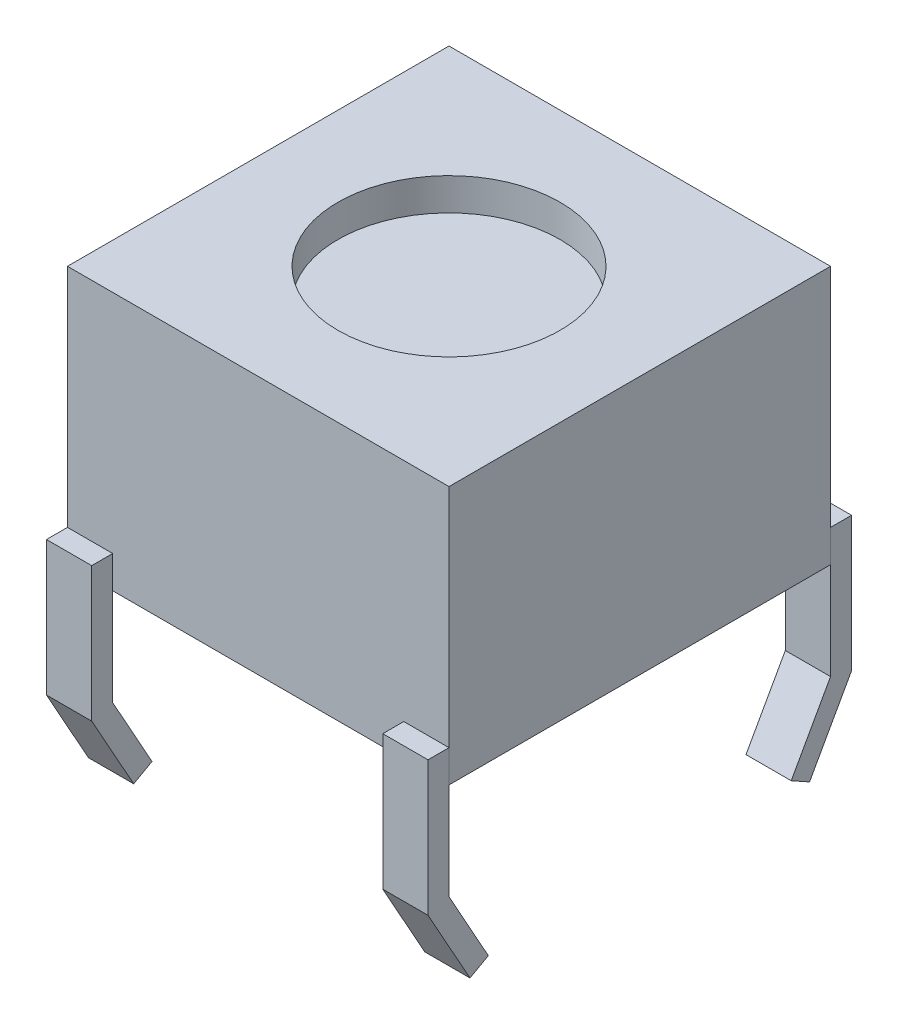
ISO-10303-21;
HEADER;
FILE_DESCRIPTION(('STEP AP214'),'2;1');
FILE_NAME('part.step','',(''),(''),'','','');
FILE_SCHEMA(('AUTOMOTIVE_DESIGN { 1 0 10303 214 1 1 1 1 }'));
ENDSEC;
DATA;
#1=APPLICATION_CONTEXT('core data for automotive mechanical design processes');
#2=APPLICATION_PROTOCOL_DEFINITION('international standard','automotive_design',2000,#1);
#3=PRODUCT_CONTEXT('',#1,'mechanical');
#4=PRODUCT('Part','Part','',(#3));
#5=PRODUCT_RELATED_PRODUCT_CATEGORY('part','',(#4));
#6=PRODUCT_DEFINITION_FORMATION('','',#4);
#7=PRODUCT_DEFINITION_CONTEXT('part definition',#1,'design');
#8=PRODUCT_DEFINITION('design','',#6,#7);
#9=PRODUCT_DEFINITION_SHAPE('','',#8);
#10=(LENGTH_UNIT() NAMED_UNIT(*) SI_UNIT(.MILLI.,.METRE.));
#11=(NAMED_UNIT(*) PLANE_ANGLE_UNIT() SI_UNIT($,.RADIAN.));
#12=(NAMED_UNIT(*) SI_UNIT($,.STERADIAN.) SOLID_ANGLE_UNIT());
#13=UNCERTAINTY_MEASURE_WITH_UNIT(LENGTH_MEASURE(1.E-05),#10,'distance_accuracy_value','');
#14=(GEOMETRIC_REPRESENTATION_CONTEXT(3) GLOBAL_UNCERTAINTY_ASSIGNED_CONTEXT((#13)) GLOBAL_UNIT_ASSIGNED_CONTEXT((#10,
#11,#12)) REPRESENTATION_CONTEXT('',''));
#15=CARTESIAN_POINT('',(0.,0.,0.));
#16=DIRECTION('',(0.,0.,1.));
#17=DIRECTION('',(1.,0.,0.));
#18=AXIS2_PLACEMENT_3D('',#15,#16,#17);
#19=CARTESIAN_POINT('',(3.,4.064,-3.));
#20=DIRECTION('',(-1.,0.,0.));
#21=DIRECTION('',(0.,0.,1.));
#22=AXIS2_PLACEMENT_3D('',#19,#20,#21);
#23=PLANE('',#22);
#24=DIRECTION('',(0.,-1.,0.));
#25=VECTOR('',#24,1.);
#26=CARTESIAN_POINT('',(3.,4.064,-3.00000000000001));
#27=LINE('',#26,#25);
#28=CARTESIAN_POINT('',(3.,0.508,-3.));
#29=VERTEX_POINT('',#28);
#30=CARTESIAN_POINT('',(3.,0.,-3.));
#31=VERTEX_POINT('',#30);
#32=EDGE_CURVE('E11',#29,#31,#27,.T.);
#33=ORIENTED_EDGE('',*,*,#32,.F.);
#34=DIRECTION('',(0.,-1.,0.));
#35=VECTOR('',#34,1.);
#36=CARTESIAN_POINT('',(3.,4.064,-3.));
#37=LINE('',#36,#35);
#38=CARTESIAN_POINT('',(3.,4.064,-3.));
#39=VERTEX_POINT('',#38);
#40=EDGE_CURVE('E446',#39,#29,#37,.T.);
#41=ORIENTED_EDGE('',*,*,#40,.F.);
#42=DIRECTION('',(0.,0.,-1.));
#43=VECTOR('',#42,1.);
#44=CARTESIAN_POINT('',(3.,4.064,-3.));
#45=LINE('',#44,#43);
#46=CARTESIAN_POINT('',(3.,4.064,3.));
#47=VERTEX_POINT('',#46);
#48=EDGE_CURVE('E414',#47,#39,#45,.T.);
#49=ORIENTED_EDGE('',*,*,#48,.F.);
#50=DIRECTION('',(0.,-1.,0.));
#51=VECTOR('',#50,1.);
#52=CARTESIAN_POINT('',(3.,4.064,3.));
#53=LINE('',#52,#51);
#54=CARTESIAN_POINT('',(3.,0.508,3.));
#55=VERTEX_POINT('',#54);
#56=EDGE_CURVE('E424',#47,#55,#53,.T.);
#57=ORIENTED_EDGE('',*,*,#56,.T.);
#58=DIRECTION('',(0.,1.,0.));
#59=VECTOR('',#58,1.);
#60=CARTESIAN_POINT('',(3.,4.064,3.));
#61=LINE('',#60,#59);
#62=CARTESIAN_POINT('',(3.,0.,3.));
#63=VERTEX_POINT('',#62);
#64=EDGE_CURVE('E450',#63,#55,#61,.T.);
#65=ORIENTED_EDGE('',*,*,#64,.F.);
#66=DIRECTION('',(0.,0.,-1.));
#67=VECTOR('',#66,1.);
#68=CARTESIAN_POINT('',(3.,0.,-3.));
#69=LINE('',#68,#67);
#70=EDGE_CURVE('E403',#63,#31,#69,.T.);
#71=ORIENTED_EDGE('',*,*,#70,.T.);
#72=EDGE_LOOP('',(#33,#41,#49,#57,#65,#71));
#73=FACE_BOUND('',#72,.T.);
#74=ADVANCED_FACE('F39',(#73),#23,.F.);
#75=CARTESIAN_POINT('',(-3.,4.064,-3.));
#76=DIRECTION('',(1.,0.,0.));
#77=DIRECTION('',(0.,0.,-1.));
#78=AXIS2_PLACEMENT_3D('',#75,#76,#77);
#79=PLANE('',#78);
#80=DIRECTION('',(0.,1.,0.));
#81=VECTOR('',#80,1.);
#82=CARTESIAN_POINT('',(-3.,4.064,-3.00000000000001));
#83=LINE('',#82,#81);
#84=CARTESIAN_POINT('',(-2.999999938,0.,-3.));
#85=VERTEX_POINT('',#84);
#86=CARTESIAN_POINT('',(-3.,0.508,-3.));
#87=VERTEX_POINT('',#86);
#88=EDGE_CURVE('E43',#85,#87,#83,.T.);
#89=ORIENTED_EDGE('',*,*,#88,.F.);
#90=DIRECTION('',(0.,0.,1.));
#91=VECTOR('',#90,1.);
#92=CARTESIAN_POINT('',(-3.,0.,-3.));
#93=LINE('',#92,#91);
#94=CARTESIAN_POINT('',(-3.,0.,3.));
#95=VERTEX_POINT('',#94);
#96=EDGE_CURVE('E430',#85,#95,#93,.T.);
#97=ORIENTED_EDGE('',*,*,#96,.T.);
#98=DIRECTION('',(0.,-1.,0.));
#99=VECTOR('',#98,1.);
#100=CARTESIAN_POINT('',(-3.,4.064,3.));
#101=LINE('',#100,#99);
#102=CARTESIAN_POINT('',(-3.,0.508,3.));
#103=VERTEX_POINT('',#102);
#104=EDGE_CURVE('E449',#103,#95,#101,.T.);
#105=ORIENTED_EDGE('',*,*,#104,.F.);
#106=DIRECTION('',(0.,-1.,0.));
#107=VECTOR('',#106,1.);
#108=CARTESIAN_POINT('',(-3.,4.064,3.));
#109=LINE('',#108,#107);
#110=CARTESIAN_POINT('',(-3.,4.064,3.));
#111=VERTEX_POINT('',#110);
#112=EDGE_CURVE('E440',#111,#103,#109,.T.);
#113=ORIENTED_EDGE('',*,*,#112,.F.);
#114=DIRECTION('',(0.,0.,1.));
#115=VECTOR('',#114,1.);
#116=CARTESIAN_POINT('',(-3.,4.064,-3.));
#117=LINE('',#116,#115);
#118=CARTESIAN_POINT('',(-3.,4.064,-3.));
#119=VERTEX_POINT('',#118);
#120=EDGE_CURVE('E420',#119,#111,#117,.T.);
#121=ORIENTED_EDGE('',*,*,#120,.F.);
#122=DIRECTION('',(0.,-1.,0.));
#123=VECTOR('',#122,1.);
#124=CARTESIAN_POINT('',(-3.,4.064,-3.));
#125=LINE('',#124,#123);
#126=EDGE_CURVE('E443',#119,#87,#125,.T.);
#127=ORIENTED_EDGE('',*,*,#126,.T.);
#128=EDGE_LOOP('',(#89,#97,#105,#113,#121,#127));
#129=FACE_BOUND('',#128,.T.);
#130=ADVANCED_FACE('F467',(#129),#79,.F.);
#131=DIRECTION('',(0.,0.,-1.));
#132=VECTOR('',#131,1.);
#133=CARTESIAN_POINT('',(3.,0.508,-3.3302));
#134=LINE('',#133,#132);
#135=CARTESIAN_POINT('',(3.,0.508,-3.3302));
#136=VERTEX_POINT('',#135);
#137=EDGE_CURVE('E295',#29,#136,#134,.T.);
#138=ORIENTED_EDGE('',*,*,#137,.F.);
#139=ORIENTED_EDGE('',*,*,#32,.T.);
#140=DIRECTION('',(0.,1.,0.));
#141=VECTOR('',#140,1.);
#142=CARTESIAN_POINT('',(3.,0.,-3.));
#143=LINE('',#142,#141);
#144=CARTESIAN_POINT('',(3.,-1.524,-3.));
#145=VERTEX_POINT('',#144);
#146=EDGE_CURVE('E283',#145,#31,#143,.T.);
#147=ORIENTED_EDGE('',*,*,#146,.F.);
#148=DIRECTION('',(0.,0.87336080929187,-0.487073810415886));
#149=VECTOR('',#148,1.);
#150=CARTESIAN_POINT('',(3.,-1.524,-3.));
#151=LINE('',#150,#149);
#152=CARTESIAN_POINT('',(3.,-2.63316822780067,-2.38141626077182));
#153=VERTEX_POINT('',#152);
#154=EDGE_CURVE('E286',#153,#145,#151,.T.);
#155=ORIENTED_EDGE('',*,*,#154,.F.);
#156=DIRECTION('',(0.,0.487073810415882,0.873360809291872));
#157=VECTOR('',#156,1.);
#158=CARTESIAN_POINT('',(3.,-2.63316822780067,-2.38141626077182));
#159=LINE('',#158,#157);
#160=CARTESIAN_POINT('',(3.,-2.794,-2.6698));
#161=VERTEX_POINT('',#160);
#162=EDGE_CURVE('E289',#161,#153,#159,.T.);
#163=ORIENTED_EDGE('',*,*,#162,.F.);
#164=DIRECTION('',(0.,-0.873360809291872,0.487073810415883));
#165=VECTOR('',#164,1.);
#166=CARTESIAN_POINT('',(3.,-2.794,-2.6698));
#167=LINE('',#166,#165);
#168=CARTESIAN_POINT('',(3.,-1.609852,-3.3302));
#169=VERTEX_POINT('',#168);
#170=EDGE_CURVE('E291',#169,#161,#167,.T.);
#171=ORIENTED_EDGE('',*,*,#170,.F.);
#172=DIRECTION('',(0.,-1.,0.));
#173=VECTOR('',#172,1.);
#174=CARTESIAN_POINT('',(3.,-1.609852,-3.3302));
#175=LINE('',#174,#173);
#176=EDGE_CURVE('E293',#136,#169,#175,.T.);
#177=ORIENTED_EDGE('',*,*,#176,.F.);
#178=EDGE_LOOP('',(#138,#139,#147,#155,#163,#171,#177));
#179=FACE_BOUND('',#178,.T.);
#180=ADVANCED_FACE('F514',(#179),#23,.F.);
#181=DIRECTION('',(0.,1.,0.));
#182=VECTOR('',#181,1.);
#183=CARTESIAN_POINT('',(-2.999999938,0.,-3.));
#184=LINE('',#183,#182);
#185=CARTESIAN_POINT('',(-2.999999938,-1.524,-3.));
#186=VERTEX_POINT('',#185);
#187=EDGE_CURVE('E236',#186,#85,#184,.T.);
#188=ORIENTED_EDGE('',*,*,#187,.T.);
#189=ORIENTED_EDGE('',*,*,#88,.T.);
#190=DIRECTION('',(0.,0.,-1.));
#191=VECTOR('',#190,1.);
#192=CARTESIAN_POINT('',(-2.999999938,0.508,-3.3302));
#193=LINE('',#192,#191);
#194=CARTESIAN_POINT('',(-2.999999938,0.508,-3.3302));
#195=VERTEX_POINT('',#194);
#196=EDGE_CURVE('E259',#87,#195,#193,.T.);
#197=ORIENTED_EDGE('',*,*,#196,.T.);
#198=DIRECTION('',(0.,-1.,0.));
#199=VECTOR('',#198,1.);
#200=CARTESIAN_POINT('',(-2.999999938,-1.609852,-3.3302));
#201=LINE('',#200,#199);
#202=CARTESIAN_POINT('',(-2.999999938,-1.609852,-3.3302));
#203=VERTEX_POINT('',#202);
#204=EDGE_CURVE('E263',#195,#203,#201,.T.);
#205=ORIENTED_EDGE('',*,*,#204,.T.);
#206=DIRECTION('',(0.,-0.873360809291872,0.487073810415883));
#207=VECTOR('',#206,1.);
#208=CARTESIAN_POINT('',(-2.999999938,-2.794,-2.6698));
#209=LINE('',#208,#207);
#210=CARTESIAN_POINT('',(-2.999999938,-2.794,-2.6698));
#211=VERTEX_POINT('',#210);
#212=EDGE_CURVE('E923',#203,#211,#209,.T.);
#213=ORIENTED_EDGE('',*,*,#212,.T.);
#214=DIRECTION('',(0.,0.487073810415882,0.873360809291872));
#215=VECTOR('',#214,1.);
#216=CARTESIAN_POINT('',(-2.999999938,-2.63316822780067,-2.38141626077182));
#217=LINE('',#216,#215);
#218=CARTESIAN_POINT('',(-2.999999938,-2.63316822780067,-2.38141626077182));
#219=VERTEX_POINT('',#218);
#220=EDGE_CURVE('E250',#211,#219,#217,.T.);
#221=ORIENTED_EDGE('',*,*,#220,.T.);
#222=DIRECTION('',(0.,0.87336080929187,-0.487073810415886));
#223=VECTOR('',#222,1.);
#224=CARTESIAN_POINT('',(-2.999999938,-1.524,-3.));
#225=LINE('',#224,#223);
#226=EDGE_CURVE('E244',#219,#186,#225,.T.);
#227=ORIENTED_EDGE('',*,*,#226,.T.);
#228=EDGE_LOOP('',(#188,#189,#197,#205,#213,#221,#227));
#229=FACE_BOUND('',#228,.T.);
#230=ADVANCED_FACE('F248',(#229),#79,.F.);
#231=CARTESIAN_POINT('',(-3.,4.064,-3.));
#232=DIRECTION('',(0.,0.,1.));
#233=DIRECTION('',(1.,0.,0.));
#234=AXIS2_PLACEMENT_3D('',#231,#232,#233);
#235=PLANE('',#234);
#236=DIRECTION('',(1.,0.,0.));
#237=VECTOR('',#236,1.);
#238=CARTESIAN_POINT('',(-2.999999938,0.508,-3.));
#239=LINE('',#238,#237);
#240=CARTESIAN_POINT('',(-2.288799938,0.508,-3.));
#241=VERTEX_POINT('',#240);
#242=EDGE_CURVE('E287',#87,#241,#239,.T.);
#243=ORIENTED_EDGE('',*,*,#242,.F.);
#244=ORIENTED_EDGE('',*,*,#126,.F.);
#245=DIRECTION('',(-1.,0.,0.));
#246=VECTOR('',#245,1.);
#247=CARTESIAN_POINT('',(-3.,4.064,-3.));
#248=LINE('',#247,#246);
#249=EDGE_CURVE('E417',#39,#119,#248,.T.);
#250=ORIENTED_EDGE('',*,*,#249,.F.);
#251=ORIENTED_EDGE('',*,*,#40,.T.);
#252=DIRECTION('',(1.,0.,0.));
#253=VECTOR('',#252,1.);
#254=CARTESIAN_POINT('',(2.2888,0.508,-3.));
#255=LINE('',#254,#253);
#256=CARTESIAN_POINT('',(2.2888,0.508,-3.));
#257=VERTEX_POINT('',#256);
#258=EDGE_CURVE('E297',#257,#29,#255,.T.);
#259=ORIENTED_EDGE('',*,*,#258,.F.);
#260=DIRECTION('',(0.,1.,0.));
#261=VECTOR('',#260,1.);
#262=CARTESIAN_POINT('',(2.2888,0.,-3.));
#263=LINE('',#262,#261);
#264=CARTESIAN_POINT('',(2.2888,0.,-3.));
#265=VERTEX_POINT('',#264);
#266=EDGE_CURVE('E271',#265,#257,#263,.T.);
#267=ORIENTED_EDGE('',*,*,#266,.F.);
#268=DIRECTION('',(-1.,0.,0.));
#269=VECTOR('',#268,1.);
#270=CARTESIAN_POINT('',(-3.,0.,-3.));
#271=LINE('',#270,#269);
#272=CARTESIAN_POINT('',(-2.288799938,0.,-3.));
#273=VERTEX_POINT('',#272);
#274=EDGE_CURVE('E431',#265,#273,#271,.T.);
#275=ORIENTED_EDGE('',*,*,#274,.T.);
#276=DIRECTION('',(0.,1.,0.));
#277=VECTOR('',#276,1.);
#278=CARTESIAN_POINT('',(-2.288799938,0.,-3.));
#279=LINE('',#278,#277);
#280=EDGE_CURVE('E55',#273,#241,#279,.T.);
#281=ORIENTED_EDGE('',*,*,#280,.T.);
#282=EDGE_LOOP('',(#243,#244,#250,#251,#259,#267,#275,#281));
#283=FACE_BOUND('',#282,.T.);
#284=ADVANCED_FACE('F522',(#283),#235,.F.);
#285=DIRECTION('',(0.,1.,0.));
#286=VECTOR('',#285,1.);
#287=CARTESIAN_POINT('',(3.,0.,3.));
#288=LINE('',#287,#286);
#289=CARTESIAN_POINT('',(3.,-1.524,3.));
#290=VERTEX_POINT('',#289);
#291=EDGE_CURVE('E398',#290,#63,#288,.T.);
#292=ORIENTED_EDGE('',*,*,#291,.T.);
#293=ORIENTED_EDGE('',*,*,#64,.T.);
#294=DIRECTION('',(0.,0.,1.));
#295=VECTOR('',#294,1.);
#296=CARTESIAN_POINT('',(3.,0.508,3.3302));
#297=LINE('',#296,#295);
#298=CARTESIAN_POINT('',(3.,0.508,3.3302));
#299=VERTEX_POINT('',#298);
#300=EDGE_CURVE('E354',#55,#299,#297,.T.);
#301=ORIENTED_EDGE('',*,*,#300,.T.);
#302=DIRECTION('',(0.,-1.,0.));
#303=VECTOR('',#302,1.);
#304=CARTESIAN_POINT('',(3.,-1.609852,3.3302));
#305=LINE('',#304,#303);
#306=CARTESIAN_POINT('',(3.,-1.609852,3.3302));
#307=VERTEX_POINT('',#306);
#308=EDGE_CURVE('E386',#299,#307,#305,.T.);
#309=ORIENTED_EDGE('',*,*,#308,.T.);
#310=DIRECTION('',(0.,-0.873360809291872,-0.487073810415883));
#311=VECTOR('',#310,1.);
#312=CARTESIAN_POINT('',(3.,-2.794,2.6698));
#313=LINE('',#312,#311);
#314=CARTESIAN_POINT('',(3.,-2.794,2.6698));
#315=VERTEX_POINT('',#314);
#316=EDGE_CURVE('E389',#307,#315,#313,.T.);
#317=ORIENTED_EDGE('',*,*,#316,.T.);
#318=DIRECTION('',(0.,0.487073810415882,-0.873360809291872));
#319=VECTOR('',#318,1.);
#320=CARTESIAN_POINT('',(3.,-2.63316822780067,2.38141626077182));
#321=LINE('',#320,#319);
#322=CARTESIAN_POINT('',(3.,-2.63316822780067,2.38141626077182));
#323=VERTEX_POINT('',#322);
#324=EDGE_CURVE('E392',#315,#323,#321,.T.);
#325=ORIENTED_EDGE('',*,*,#324,.T.);
#326=DIRECTION('',(0.,0.87336080929187,0.487073810415886));
#327=VECTOR('',#326,1.);
#328=CARTESIAN_POINT('',(3.,-1.524,3.));
#329=LINE('',#328,#327);
#330=EDGE_CURVE('E395',#323,#290,#329,.T.);
#331=ORIENTED_EDGE('',*,*,#330,.T.);
#332=EDGE_LOOP('',(#292,#293,#301,#309,#317,#325,#331));
#333=FACE_BOUND('',#332,.T.);
#334=ADVANCED_FACE('F41',(#333),#23,.F.);
#335=DIRECTION('',(0.,0.,1.));
#336=VECTOR('',#335,1.);
#337=CARTESIAN_POINT('',(-2.999999938,0.508,3.3302));
#338=LINE('',#337,#336);
#339=CARTESIAN_POINT('',(-2.999999938,0.508,3.3302));
#340=VERTEX_POINT('',#339);
#341=EDGE_CURVE('E318',#103,#340,#338,.T.);
#342=ORIENTED_EDGE('',*,*,#341,.F.);
#343=ORIENTED_EDGE('',*,*,#104,.T.);
#344=DIRECTION('',(0.,1.,0.));
#345=VECTOR('',#344,1.);
#346=CARTESIAN_POINT('',(-2.999999938,0.,3.));
#347=LINE('',#346,#345);
#348=CARTESIAN_POINT('',(-2.999999938,-1.524,3.));
#349=VERTEX_POINT('',#348);
#350=EDGE_CURVE('E315',#349,#95,#347,.T.);
#351=ORIENTED_EDGE('',*,*,#350,.F.);
#352=DIRECTION('',(0.,0.87336080929187,0.487073810415886));
#353=VECTOR('',#352,1.);
#354=CARTESIAN_POINT('',(-2.999999938,-1.524,3.));
#355=LINE('',#354,#353);
#356=CARTESIAN_POINT('',(-2.999999938,-2.63316822780067,2.38141626077182));
#357=VERTEX_POINT('',#356);
#358=EDGE_CURVE('E331',#357,#349,#355,.T.);
#359=ORIENTED_EDGE('',*,*,#358,.F.);
#360=DIRECTION('',(0.,0.487073810415882,-0.873360809291872));
#361=VECTOR('',#360,1.);
#362=CARTESIAN_POINT('',(-2.999999938,-2.63316822780067,2.38141626077182));
#363=LINE('',#362,#361);
#364=CARTESIAN_POINT('',(-2.999999938,-2.794,2.6698));
#365=VERTEX_POINT('',#364);
#366=EDGE_CURVE('E328',#365,#357,#363,.T.);
#367=ORIENTED_EDGE('',*,*,#366,.F.);
#368=DIRECTION('',(0.,-0.873360809291872,-0.487073810415883));
#369=VECTOR('',#368,1.);
#370=CARTESIAN_POINT('',(-2.999999938,-2.794,2.6698));
#371=LINE('',#370,#369);
#372=CARTESIAN_POINT('',(-2.999999938,-1.609852,3.3302));
#373=VERTEX_POINT('',#372);
#374=EDGE_CURVE('E325',#373,#365,#371,.T.);
#375=ORIENTED_EDGE('',*,*,#374,.F.);
#376=DIRECTION('',(0.,-1.,0.));
#377=VECTOR('',#376,1.);
#378=CARTESIAN_POINT('',(-2.999999938,-1.609852,3.3302));
#379=LINE('',#378,#377);
#380=EDGE_CURVE('E322',#340,#373,#379,.T.);
#381=ORIENTED_EDGE('',*,*,#380,.F.);
#382=EDGE_LOOP('',(#342,#343,#351,#359,#367,#375,#381));
#383=FACE_BOUND('',#382,.T.);
#384=ADVANCED_FACE('F459',(#383),#79,.F.);
#385=CARTESIAN_POINT('',(-3.,4.064,3.));
#386=DIRECTION('',(0.,0.,-1.));
#387=DIRECTION('',(-1.,0.,0.));
#388=AXIS2_PLACEMENT_3D('',#385,#386,#387);
#389=PLANE('',#388);
#390=ORIENTED_EDGE('',*,*,#112,.T.);
#391=DIRECTION('',(1.,0.,0.));
#392=VECTOR('',#391,1.);
#393=CARTESIAN_POINT('',(-2.999999938,0.508,3.));
#394=LINE('',#393,#392);
#395=CARTESIAN_POINT('',(-2.288799938,0.508,3.));
#396=VERTEX_POINT('',#395);
#397=EDGE_CURVE('E334',#103,#396,#394,.T.);
#398=ORIENTED_EDGE('',*,*,#397,.T.);
#399=DIRECTION('',(0.,1.,0.));
#400=VECTOR('',#399,1.);
#401=CARTESIAN_POINT('',(-2.288799938,0.,3.));
#402=LINE('',#401,#400);
#403=CARTESIAN_POINT('',(-2.288799938,0.,3.));
#404=VERTEX_POINT('',#403);
#405=EDGE_CURVE('E349',#404,#396,#402,.T.);
#406=ORIENTED_EDGE('',*,*,#405,.F.);
#407=DIRECTION('',(1.,0.,0.));
#408=VECTOR('',#407,1.);
#409=CARTESIAN_POINT('',(-3.,0.,3.));
#410=LINE('',#409,#408);
#411=CARTESIAN_POINT('',(2.2888,0.,3.));
#412=VERTEX_POINT('',#411);
#413=EDGE_CURVE('E437',#404,#412,#410,.T.);
#414=ORIENTED_EDGE('',*,*,#413,.T.);
#415=DIRECTION('',(0.,1.,0.));
#416=VECTOR('',#415,1.);
#417=CARTESIAN_POINT('',(2.2888,0.,3.));
#418=LINE('',#417,#416);
#419=CARTESIAN_POINT('',(2.2888,0.508,3.));
#420=VERTEX_POINT('',#419);
#421=EDGE_CURVE('E368',#412,#420,#418,.T.);
#422=ORIENTED_EDGE('',*,*,#421,.T.);
#423=DIRECTION('',(1.,0.,0.));
#424=VECTOR('',#423,1.);
#425=CARTESIAN_POINT('',(2.2888,0.508,3.));
#426=LINE('',#425,#424);
#427=EDGE_CURVE('E383',#420,#55,#426,.T.);
#428=ORIENTED_EDGE('',*,*,#427,.T.);
#429=ORIENTED_EDGE('',*,*,#56,.F.);
#430=DIRECTION('',(1.,0.,0.));
#431=VECTOR('',#430,1.);
#432=CARTESIAN_POINT('',(-3.,4.064,3.));
#433=LINE('',#432,#431);
#434=EDGE_CURVE('E422',#111,#47,#433,.T.);
#435=ORIENTED_EDGE('',*,*,#434,.F.);
#436=EDGE_LOOP('',(#390,#398,#406,#414,#422,#428,#429,#435));
#437=FACE_BOUND('',#436,.T.);
#438=ADVANCED_FACE('F496',(#437),#389,.F.);
#439=CARTESIAN_POINT('',(0.,4.064,0.));
#440=DIRECTION('',(0.,1.,0.));
#441=DIRECTION('',(0.,0.,1.));
#442=AXIS2_PLACEMENT_3D('',#439,#440,#441);
#443=PLANE('',#442);
#444=CARTESIAN_POINT('',(0.,4.064,0.));
#445=DIRECTION('',(0.,1.,0.));
#446=DIRECTION('',(0.,0.,1.));
#447=AXIS2_PLACEMENT_3D('',#444,#445,#446);
#448=CIRCLE('',#447,1.74625);
#449=CARTESIAN_POINT('',(0.,4.064,1.74625));
#450=VERTEX_POINT('',#449);
#451=EDGE_CURVE('E915',#450,#450,#448,.T.);
#452=ORIENTED_EDGE('',*,*,#451,.F.);
#453=EDGE_LOOP('',(#452));
#454=FACE_BOUND('',#453,.T.);
#455=ORIENTED_EDGE('',*,*,#48,.T.);
#456=ORIENTED_EDGE('',*,*,#249,.T.);
#457=ORIENTED_EDGE('',*,*,#120,.T.);
#458=ORIENTED_EDGE('',*,*,#434,.T.);
#459=EDGE_LOOP('',(#455,#456,#457,#458));
#460=FACE_BOUND('',#459,.T.);
#461=ADVANCED_FACE('F574',(#454,#460),#443,.T.);
#462=CARTESIAN_POINT('',(0.,0.,0.));
#463=DIRECTION('',(0.,1.,0.));
#464=DIRECTION('',(0.,0.,1.));
#465=AXIS2_PLACEMENT_3D('',#462,#463,#464);
#466=PLANE('',#465);
#467=ORIENTED_EDGE('',*,*,#70,.F.);
#468=EDGE_CURVE('E434',#412,#63,#410,.T.);
#469=ORIENTED_EDGE('',*,*,#468,.F.);
#470=ORIENTED_EDGE('',*,*,#413,.F.);
#471=EDGE_CURVE('E418',#95,#404,#410,.T.);
#472=ORIENTED_EDGE('',*,*,#471,.F.);
#473=ORIENTED_EDGE('',*,*,#96,.F.);
#474=EDGE_CURVE('E243',#273,#85,#271,.T.);
#475=ORIENTED_EDGE('',*,*,#474,.F.);
#476=ORIENTED_EDGE('',*,*,#274,.F.);
#477=EDGE_CURVE('E427',#31,#265,#271,.T.);
#478=ORIENTED_EDGE('',*,*,#477,.F.);
#479=EDGE_LOOP('',(#467,#469,#470,#472,#473,#475,#476,#478));
#480=FACE_BOUND('',#479,.T.);
#481=ADVANCED_FACE('F470',(#480),#466,.F.);
#482=CARTESIAN_POINT('',(2.2888,0.,3.));
#483=DIRECTION('',(0.,0.,-1.));
#484=DIRECTION('',(0.,1.,0.));
#485=AXIS2_PLACEMENT_3D('',#482,#483,#484);
#486=PLANE('',#485);
#487=ORIENTED_EDGE('',*,*,#468,.T.);
#488=ORIENTED_EDGE('',*,*,#291,.F.);
#489=DIRECTION('',(1.,0.,0.));
#490=VECTOR('',#489,1.);
#491=CARTESIAN_POINT('',(2.2888,-1.524,3.));
#492=LINE('',#491,#490);
#493=CARTESIAN_POINT('',(2.2888,-1.524,3.));
#494=VERTEX_POINT('',#493);
#495=EDGE_CURVE('E401',#494,#290,#492,.T.);
#496=ORIENTED_EDGE('',*,*,#495,.F.);
#497=EDGE_CURVE('E364',#494,#412,#418,.T.);
#498=ORIENTED_EDGE('',*,*,#497,.T.);
#499=EDGE_LOOP('',(#487,#488,#496,#498));
#500=FACE_BOUND('',#499,.T.);
#501=ADVANCED_FACE('F533',(#500),#486,.T.);
#502=CARTESIAN_POINT('',(2.2888,-1.524,3.));
#503=DIRECTION('',(0.,0.487073810415886,-0.87336080929187));
#504=DIRECTION('',(0.,0.87336080929187,0.487073810415886));
#505=AXIS2_PLACEMENT_3D('',#502,#503,#504);
#506=PLANE('',#505);
#507=ORIENTED_EDGE('',*,*,#330,.F.);
#508=DIRECTION('',(1.,0.,0.));
#509=VECTOR('',#508,1.);
#510=CARTESIAN_POINT('',(2.2888,-2.63316822780067,2.38141626077182));
#511=LINE('',#510,#509);
#512=CARTESIAN_POINT('',(2.2888,-2.63316822780067,2.38141626077182));
#513=VERTEX_POINT('',#512);
#514=EDGE_CURVE('E404',#513,#323,#511,.T.);
#515=ORIENTED_EDGE('',*,*,#514,.F.);
#516=DIRECTION('',(0.,0.87336080929187,0.487073810415886));
#517=VECTOR('',#516,1.);
#518=CARTESIAN_POINT('',(2.2888,-1.524,3.));
#519=LINE('',#518,#517);
#520=EDGE_CURVE('E380',#513,#494,#519,.T.);
#521=ORIENTED_EDGE('',*,*,#520,.T.);
#522=ORIENTED_EDGE('',*,*,#495,.T.);
#523=EDGE_LOOP('',(#507,#515,#521,#522));
#524=FACE_BOUND('',#523,.T.);
#525=ADVANCED_FACE('F557',(#524),#506,.T.);
#526=CARTESIAN_POINT('',(2.2888,-2.63316822780067,2.38141626077182));
#527=DIRECTION('',(0.,-0.873360809291872,-0.487073810415882));
#528=DIRECTION('',(0.,0.487073810415882,-0.873360809291872));
#529=AXIS2_PLACEMENT_3D('',#526,#527,#528);
#530=PLANE('',#529);
#531=ORIENTED_EDGE('',*,*,#324,.F.);
#532=DIRECTION('',(1.,0.,0.));
#533=VECTOR('',#532,1.);
#534=CARTESIAN_POINT('',(2.2888,-2.794,2.6698));
#535=LINE('',#534,#533);
#536=CARTESIAN_POINT('',(2.2888,-2.794,2.6698));
#537=VERTEX_POINT('',#536);
#538=EDGE_CURVE('E406',#537,#315,#535,.T.);
#539=ORIENTED_EDGE('',*,*,#538,.F.);
#540=DIRECTION('',(0.,0.487073810415882,-0.873360809291872));
#541=VECTOR('',#540,1.);
#542=CARTESIAN_POINT('',(2.2888,-2.63316822780067,2.38141626077182));
#543=LINE('',#542,#541);
#544=EDGE_CURVE('E377',#537,#513,#543,.T.);
#545=ORIENTED_EDGE('',*,*,#544,.T.);
#546=ORIENTED_EDGE('',*,*,#514,.T.);
#547=EDGE_LOOP('',(#531,#539,#545,#546));
#548=FACE_BOUND('',#547,.T.);
#549=ADVANCED_FACE('F554',(#548),#530,.T.);
#550=CARTESIAN_POINT('',(2.2888,-2.794,2.6698));
#551=DIRECTION('',(0.,-0.487073810415883,0.873360809291872));
#552=DIRECTION('',(0.,-0.873360809291872,-0.487073810415883));
#553=AXIS2_PLACEMENT_3D('',#550,#551,#552);
#554=PLANE('',#553);
#555=ORIENTED_EDGE('',*,*,#316,.F.);
#556=DIRECTION('',(1.,0.,0.));
#557=VECTOR('',#556,1.);
#558=CARTESIAN_POINT('',(2.2888,-1.609852,3.3302));
#559=LINE('',#558,#557);
#560=CARTESIAN_POINT('',(2.2888,-1.609852,3.3302));
#561=VERTEX_POINT('',#560);
#562=EDGE_CURVE('E408',#561,#307,#559,.T.);
#563=ORIENTED_EDGE('',*,*,#562,.F.);
#564=DIRECTION('',(0.,-0.873360809291872,-0.487073810415883));
#565=VECTOR('',#564,1.);
#566=CARTESIAN_POINT('',(2.2888,-2.794,2.6698));
#567=LINE('',#566,#565);
#568=EDGE_CURVE('E374',#561,#537,#567,.T.);
#569=ORIENTED_EDGE('',*,*,#568,.T.);
#570=ORIENTED_EDGE('',*,*,#538,.T.);
#571=EDGE_LOOP('',(#555,#563,#569,#570));
#572=FACE_BOUND('',#571,.T.);
#573=ADVANCED_FACE('F552',(#572),#554,.T.);
#574=CARTESIAN_POINT('',(2.2888,-1.609852,3.3302));
#575=DIRECTION('',(0.,0.,1.));
#576=DIRECTION('',(0.,-1.,0.));
#577=AXIS2_PLACEMENT_3D('',#574,#575,#576);
#578=PLANE('',#577);
#579=ORIENTED_EDGE('',*,*,#308,.F.);
#580=DIRECTION('',(1.,0.,0.));
#581=VECTOR('',#580,1.);
#582=CARTESIAN_POINT('',(2.2888,0.508,3.3302));
#583=LINE('',#582,#581);
#584=CARTESIAN_POINT('',(2.2888,0.508,3.3302));
#585=VERTEX_POINT('',#584);
#586=EDGE_CURVE('E410',#585,#299,#583,.T.);
#587=ORIENTED_EDGE('',*,*,#586,.F.);
#588=DIRECTION('',(0.,-1.,0.));
#589=VECTOR('',#588,1.);
#590=CARTESIAN_POINT('',(2.2888,-1.609852,3.3302));
#591=LINE('',#590,#589);
#592=EDGE_CURVE('E371',#585,#561,#591,.T.);
#593=ORIENTED_EDGE('',*,*,#592,.T.);
#594=ORIENTED_EDGE('',*,*,#562,.T.);
#595=EDGE_LOOP('',(#579,#587,#593,#594));
#596=FACE_BOUND('',#595,.T.);
#597=ADVANCED_FACE('F548',(#596),#578,.T.);
#598=CARTESIAN_POINT('',(2.2888,0.508,3.3302));
#599=DIRECTION('',(0.,1.,0.));
#600=DIRECTION('',(0.,0.,1.));
#601=AXIS2_PLACEMENT_3D('',#598,#599,#600);
#602=PLANE('',#601);
#603=ORIENTED_EDGE('',*,*,#300,.F.);
#604=ORIENTED_EDGE('',*,*,#427,.F.);
#605=DIRECTION('',(0.,0.,1.));
#606=VECTOR('',#605,1.);
#607=CARTESIAN_POINT('',(2.2888,0.508,3.3302));
#608=LINE('',#607,#606);
#609=EDGE_CURVE('E367',#420,#585,#608,.T.);
#610=ORIENTED_EDGE('',*,*,#609,.T.);
#611=ORIENTED_EDGE('',*,*,#586,.T.);
#612=EDGE_LOOP('',(#603,#604,#610,#611));
#613=FACE_BOUND('',#612,.T.);
#614=ADVANCED_FACE('F541',(#613),#602,.T.);
#615=CARTESIAN_POINT('',(2.2888,0.,0.));
#616=DIRECTION('',(-1.,0.,0.));
#617=DIRECTION('',(0.,0.,1.));
#618=AXIS2_PLACEMENT_3D('',#615,#616,#617);
#619=PLANE('',#618);
#620=ORIENTED_EDGE('',*,*,#497,.F.);
#621=ORIENTED_EDGE('',*,*,#520,.F.);
#622=ORIENTED_EDGE('',*,*,#544,.F.);
#623=ORIENTED_EDGE('',*,*,#568,.F.);
#624=ORIENTED_EDGE('',*,*,#592,.F.);
#625=ORIENTED_EDGE('',*,*,#609,.F.);
#626=ORIENTED_EDGE('',*,*,#421,.F.);
#627=EDGE_LOOP('',(#620,#621,#622,#623,#624,#625,#626));
#628=FACE_BOUND('',#627,.T.);
#629=ADVANCED_FACE('F543',(#628),#619,.T.);
#630=CARTESIAN_POINT('',(-2.999999938,0.,3.));
#631=DIRECTION('',(0.,0.,-1.));
#632=DIRECTION('',(0.,1.,0.));
#633=AXIS2_PLACEMENT_3D('',#630,#631,#632);
#634=PLANE('',#633);
#635=ORIENTED_EDGE('',*,*,#471,.T.);
#636=CARTESIAN_POINT('',(-2.288799938,-1.524,3.));
#637=VERTEX_POINT('',#636);
#638=EDGE_CURVE('E319',#637,#404,#402,.T.);
#639=ORIENTED_EDGE('',*,*,#638,.F.);
#640=DIRECTION('',(1.,0.,0.));
#641=VECTOR('',#640,1.);
#642=CARTESIAN_POINT('',(-2.999999938,-1.524,3.));
#643=LINE('',#642,#641);
#644=EDGE_CURVE('E352',#349,#637,#643,.T.);
#645=ORIENTED_EDGE('',*,*,#644,.F.);
#646=ORIENTED_EDGE('',*,*,#350,.T.);
#647=EDGE_LOOP('',(#635,#639,#645,#646));
#648=FACE_BOUND('',#647,.T.);
#649=ADVANCED_FACE('F475',(#648),#634,.T.);
#650=CARTESIAN_POINT('',(-2.999999938,-1.524,3.));
#651=DIRECTION('',(0.,0.487073810415886,-0.87336080929187));
#652=DIRECTION('',(0.,0.87336080929187,0.487073810415886));
#653=AXIS2_PLACEMENT_3D('',#650,#651,#652);
#654=PLANE('',#653);
#655=DIRECTION('',(0.,0.87336080929187,0.487073810415886));
#656=VECTOR('',#655,1.);
#657=CARTESIAN_POINT('',(-2.288799938,-1.524,3.));
#658=LINE('',#657,#656);
#659=CARTESIAN_POINT('',(-2.288799938,-2.63316822780067,2.38141626077182));
#660=VERTEX_POINT('',#659);
#661=EDGE_CURVE('E346',#660,#637,#658,.T.);
#662=ORIENTED_EDGE('',*,*,#661,.F.);
#663=DIRECTION('',(1.,0.,0.));
#664=VECTOR('',#663,1.);
#665=CARTESIAN_POINT('',(-2.999999938,-2.63316822780067,2.38141626077182));
#666=LINE('',#665,#664);
#667=EDGE_CURVE('E355',#357,#660,#666,.T.);
#668=ORIENTED_EDGE('',*,*,#667,.F.);
#669=ORIENTED_EDGE('',*,*,#358,.T.);
#670=ORIENTED_EDGE('',*,*,#644,.T.);
#671=EDGE_LOOP('',(#662,#668,#669,#670));
#672=FACE_BOUND('',#671,.T.);
#673=ADVANCED_FACE('F478',(#672),#654,.T.);
#674=CARTESIAN_POINT('',(-2.999999938,-2.63316822780067,2.38141626077182));
#675=DIRECTION('',(0.,-0.873360809291872,-0.487073810415882));
#676=DIRECTION('',(0.,0.487073810415882,-0.873360809291872));
#677=AXIS2_PLACEMENT_3D('',#674,#675,#676);
#678=PLANE('',#677);
#679=DIRECTION('',(0.,0.487073810415882,-0.873360809291872));
#680=VECTOR('',#679,1.);
#681=CARTESIAN_POINT('',(-2.288799938,-2.63316822780067,2.38141626077182));
#682=LINE('',#681,#680);
#683=CARTESIAN_POINT('',(-2.288799938,-2.794,2.6698));
#684=VERTEX_POINT('',#683);
#685=EDGE_CURVE('E343',#684,#660,#682,.T.);
#686=ORIENTED_EDGE('',*,*,#685,.F.);
#687=DIRECTION('',(1.,0.,0.));
#688=VECTOR('',#687,1.);
#689=CARTESIAN_POINT('',(-2.999999938,-2.794,2.6698));
#690=LINE('',#689,#688);
#691=EDGE_CURVE('E357',#365,#684,#690,.T.);
#692=ORIENTED_EDGE('',*,*,#691,.F.);
#693=ORIENTED_EDGE('',*,*,#366,.T.);
#694=ORIENTED_EDGE('',*,*,#667,.T.);
#695=EDGE_LOOP('',(#686,#692,#693,#694));
#696=FACE_BOUND('',#695,.T.);
#697=ADVANCED_FACE('F483',(#696),#678,.T.);
#698=CARTESIAN_POINT('',(-2.999999938,-2.794,2.6698));
#699=DIRECTION('',(0.,-0.487073810415883,0.873360809291872));
#700=DIRECTION('',(0.,-0.873360809291872,-0.487073810415883));
#701=AXIS2_PLACEMENT_3D('',#698,#699,#700);
#702=PLANE('',#701);
#703=DIRECTION('',(0.,-0.873360809291872,-0.487073810415883));
#704=VECTOR('',#703,1.);
#705=CARTESIAN_POINT('',(-2.288799938,-2.794,2.6698));
#706=LINE('',#705,#704);
#707=CARTESIAN_POINT('',(-2.288799938,-1.609852,3.3302));
#708=VERTEX_POINT('',#707);
#709=EDGE_CURVE('E340',#708,#684,#706,.T.);
#710=ORIENTED_EDGE('',*,*,#709,.F.);
#711=DIRECTION('',(1.,0.,0.));
#712=VECTOR('',#711,1.);
#713=CARTESIAN_POINT('',(-2.999999938,-1.609852,3.3302));
#714=LINE('',#713,#712);
#715=EDGE_CURVE('E359',#373,#708,#714,.T.);
#716=ORIENTED_EDGE('',*,*,#715,.F.);
#717=ORIENTED_EDGE('',*,*,#374,.T.);
#718=ORIENTED_EDGE('',*,*,#691,.T.);
#719=EDGE_LOOP('',(#710,#716,#717,#718));
#720=FACE_BOUND('',#719,.T.);
#721=ADVANCED_FACE('F486',(#720),#702,.T.);
#722=CARTESIAN_POINT('',(-2.999999938,-1.609852,3.3302));
#723=DIRECTION('',(0.,0.,1.));
#724=DIRECTION('',(0.,-1.,0.));
#725=AXIS2_PLACEMENT_3D('',#722,#723,#724);
#726=PLANE('',#725);
#727=DIRECTION('',(0.,-1.,0.));
#728=VECTOR('',#727,1.);
#729=CARTESIAN_POINT('',(-2.288799938,-1.609852,3.3302));
#730=LINE('',#729,#728);
#731=CARTESIAN_POINT('',(-2.288799938,0.508,3.3302));
#732=VERTEX_POINT('',#731);
#733=EDGE_CURVE('E337',#732,#708,#730,.T.);
#734=ORIENTED_EDGE('',*,*,#733,.F.);
#735=DIRECTION('',(1.,0.,0.));
#736=VECTOR('',#735,1.);
#737=CARTESIAN_POINT('',(-2.999999938,0.508,3.3302));
#738=LINE('',#737,#736);
#739=EDGE_CURVE('E361',#340,#732,#738,.T.);
#740=ORIENTED_EDGE('',*,*,#739,.F.);
#741=ORIENTED_EDGE('',*,*,#380,.T.);
#742=ORIENTED_EDGE('',*,*,#715,.T.);
#743=EDGE_LOOP('',(#734,#740,#741,#742));
#744=FACE_BOUND('',#743,.T.);
#745=ADVANCED_FACE('F489',(#744),#726,.T.);
#746=CARTESIAN_POINT('',(-2.999999938,0.508,3.3302));
#747=DIRECTION('',(0.,1.,0.));
#748=DIRECTION('',(0.,0.,1.));
#749=AXIS2_PLACEMENT_3D('',#746,#747,#748);
#750=PLANE('',#749);
#751=DIRECTION('',(0.,0.,1.));
#752=VECTOR('',#751,1.);
#753=CARTESIAN_POINT('',(-2.288799938,0.508,3.3302));
#754=LINE('',#753,#752);
#755=EDGE_CURVE('E300',#396,#732,#754,.T.);
#756=ORIENTED_EDGE('',*,*,#755,.F.);
#757=ORIENTED_EDGE('',*,*,#397,.F.);
#758=ORIENTED_EDGE('',*,*,#341,.T.);
#759=ORIENTED_EDGE('',*,*,#739,.T.);
#760=EDGE_LOOP('',(#756,#757,#758,#759));
#761=FACE_BOUND('',#760,.T.);
#762=ADVANCED_FACE('F492',(#761),#750,.T.);
#763=CARTESIAN_POINT('',(-2.288799938,0.,0.));
#764=DIRECTION('',(-1.,0.,0.));
#765=DIRECTION('',(0.,0.,1.));
#766=AXIS2_PLACEMENT_3D('',#763,#764,#765);
#767=PLANE('',#766);
#768=ORIENTED_EDGE('',*,*,#638,.T.);
#769=ORIENTED_EDGE('',*,*,#405,.T.);
#770=ORIENTED_EDGE('',*,*,#755,.T.);
#771=ORIENTED_EDGE('',*,*,#733,.T.);
#772=ORIENTED_EDGE('',*,*,#709,.T.);
#773=ORIENTED_EDGE('',*,*,#685,.T.);
#774=ORIENTED_EDGE('',*,*,#661,.T.);
#775=EDGE_LOOP('',(#768,#769,#770,#771,#772,#773,#774));
#776=FACE_BOUND('',#775,.T.);
#777=ADVANCED_FACE('F499',(#776),#767,.F.);
#778=CARTESIAN_POINT('',(2.2888,0.,-3.));
#779=DIRECTION('',(0.,0.,-1.));
#780=DIRECTION('',(0.,1.,0.));
#781=AXIS2_PLACEMENT_3D('',#778,#779,#780);
#782=PLANE('',#781);
#783=ORIENTED_EDGE('',*,*,#146,.T.);
#784=ORIENTED_EDGE('',*,*,#477,.T.);
#785=CARTESIAN_POINT('',(2.2888,-1.524,-3.));
#786=VERTEX_POINT('',#785);
#787=EDGE_CURVE('E267',#786,#265,#263,.T.);
#788=ORIENTED_EDGE('',*,*,#787,.F.);
#789=DIRECTION('',(1.,0.,0.));
#790=VECTOR('',#789,1.);
#791=CARTESIAN_POINT('',(2.2888,-1.524,-3.));
#792=LINE('',#791,#790);
#793=EDGE_CURVE('E282',#786,#145,#792,.T.);
#794=ORIENTED_EDGE('',*,*,#793,.T.);
#795=EDGE_LOOP('',(#783,#784,#788,#794));
#796=FACE_BOUND('',#795,.T.);
#797=ADVANCED_FACE('F501',(#796),#782,.F.);
#798=CARTESIAN_POINT('',(2.2888,0.508,-3.3302));
#799=DIRECTION('',(0.,-1.,0.));
#800=DIRECTION('',(0.,0.,-1.));
#801=AXIS2_PLACEMENT_3D('',#798,#799,#800);
#802=PLANE('',#801);
#803=ORIENTED_EDGE('',*,*,#137,.T.);
#804=DIRECTION('',(1.,0.,0.));
#805=VECTOR('',#804,1.);
#806=CARTESIAN_POINT('',(2.2888,0.508,-3.3302));
#807=LINE('',#806,#805);
#808=CARTESIAN_POINT('',(2.2888,0.508,-3.3302));
#809=VERTEX_POINT('',#808);
#810=EDGE_CURVE('E301',#809,#136,#807,.T.);
#811=ORIENTED_EDGE('',*,*,#810,.F.);
#812=DIRECTION('',(0.,0.,-1.));
#813=VECTOR('',#812,1.);
#814=CARTESIAN_POINT('',(2.2888,0.508,-3.3302));
#815=LINE('',#814,#813);
#816=EDGE_CURVE('E280',#257,#809,#815,.T.);
#817=ORIENTED_EDGE('',*,*,#816,.F.);
#818=ORIENTED_EDGE('',*,*,#258,.T.);
#819=EDGE_LOOP('',(#803,#811,#817,#818));
#820=FACE_BOUND('',#819,.T.);
#821=ADVANCED_FACE('F507',(#820),#802,.F.);
#822=CARTESIAN_POINT('',(2.2888,-1.609852,-3.3302));
#823=DIRECTION('',(0.,0.,1.));
#824=DIRECTION('',(0.,-1.,0.));
#825=AXIS2_PLACEMENT_3D('',#822,#823,#824);
#826=PLANE('',#825);
#827=ORIENTED_EDGE('',*,*,#176,.T.);
#828=DIRECTION('',(1.,0.,0.));
#829=VECTOR('',#828,1.);
#830=CARTESIAN_POINT('',(2.2888,-1.609852,-3.3302));
#831=LINE('',#830,#829);
#832=CARTESIAN_POINT('',(2.2888,-1.609852,-3.3302));
#833=VERTEX_POINT('',#832);
#834=EDGE_CURVE('E304',#833,#169,#831,.T.);
#835=ORIENTED_EDGE('',*,*,#834,.F.);
#836=DIRECTION('',(0.,-1.,0.));
#837=VECTOR('',#836,1.);
#838=CARTESIAN_POINT('',(2.2888,-1.609852,-3.3302));
#839=LINE('',#838,#837);
#840=EDGE_CURVE('E278',#809,#833,#839,.T.);
#841=ORIENTED_EDGE('',*,*,#840,.F.);
#842=ORIENTED_EDGE('',*,*,#810,.T.);
#843=EDGE_LOOP('',(#827,#835,#841,#842));
#844=FACE_BOUND('',#843,.T.);
#845=ADVANCED_FACE('F704',(#844),#826,.F.);
#846=CARTESIAN_POINT('',(2.2888,-2.794,-2.6698));
#847=DIRECTION('',(0.,0.487073810415883,0.873360809291872));
#848=DIRECTION('',(0.,-0.873360809291872,0.487073810415883));
#849=AXIS2_PLACEMENT_3D('',#846,#847,#848);
#850=PLANE('',#849);
#851=ORIENTED_EDGE('',*,*,#170,.T.);
#852=DIRECTION('',(1.,0.,0.));
#853=VECTOR('',#852,1.);
#854=CARTESIAN_POINT('',(2.2888,-2.794,-2.6698));
#855=LINE('',#854,#853);
#856=CARTESIAN_POINT('',(2.2888,-2.794,-2.6698));
#857=VERTEX_POINT('',#856);
#858=EDGE_CURVE('E307',#857,#161,#855,.T.);
#859=ORIENTED_EDGE('',*,*,#858,.F.);
#860=DIRECTION('',(0.,-0.873360809291872,0.487073810415883));
#861=VECTOR('',#860,1.);
#862=CARTESIAN_POINT('',(2.2888,-2.794,-2.6698));
#863=LINE('',#862,#861);
#864=EDGE_CURVE('E276',#833,#857,#863,.T.);
#865=ORIENTED_EDGE('',*,*,#864,.F.);
#866=ORIENTED_EDGE('',*,*,#834,.T.);
#867=EDGE_LOOP('',(#851,#859,#865,#866));
#868=FACE_BOUND('',#867,.T.);
#869=ADVANCED_FACE('F716',(#868),#850,.F.);
#870=CARTESIAN_POINT('',(2.2888,-2.63316822780067,-2.38141626077182));
#871=DIRECTION('',(0.,0.873360809291872,-0.487073810415882));
#872=DIRECTION('',(0.,0.487073810415882,0.873360809291872));
#873=AXIS2_PLACEMENT_3D('',#870,#871,#872);
#874=PLANE('',#873);
#875=ORIENTED_EDGE('',*,*,#162,.T.);
#876=DIRECTION('',(1.,0.,0.));
#877=VECTOR('',#876,1.);
#878=CARTESIAN_POINT('',(2.2888,-2.63316822780067,-2.38141626077182));
#879=LINE('',#878,#877);
#880=CARTESIAN_POINT('',(2.2888,-2.63316822780067,-2.38141626077182));
#881=VERTEX_POINT('',#880);
#882=EDGE_CURVE('E310',#881,#153,#879,.T.);
#883=ORIENTED_EDGE('',*,*,#882,.F.);
#884=DIRECTION('',(0.,0.487073810415882,0.873360809291872));
#885=VECTOR('',#884,1.);
#886=CARTESIAN_POINT('',(2.2888,-2.63316822780067,-2.38141626077182));
#887=LINE('',#886,#885);
#888=EDGE_CURVE('E274',#857,#881,#887,.T.);
#889=ORIENTED_EDGE('',*,*,#888,.F.);
#890=ORIENTED_EDGE('',*,*,#858,.T.);
#891=EDGE_LOOP('',(#875,#883,#889,#890));
#892=FACE_BOUND('',#891,.T.);
#893=ADVANCED_FACE('F728',(#892),#874,.F.);
#894=CARTESIAN_POINT('',(2.2888,-1.524,-3.));
#895=DIRECTION('',(0.,-0.487073810415886,-0.87336080929187));
#896=DIRECTION('',(0.,0.87336080929187,-0.487073810415886));
#897=AXIS2_PLACEMENT_3D('',#894,#895,#896);
#898=PLANE('',#897);
#899=ORIENTED_EDGE('',*,*,#154,.T.);
#900=ORIENTED_EDGE('',*,*,#793,.F.);
#901=DIRECTION('',(0.,0.87336080929187,-0.487073810415886));
#902=VECTOR('',#901,1.);
#903=CARTESIAN_POINT('',(2.2888,-1.524,-3.));
#904=LINE('',#903,#902);
#905=EDGE_CURVE('E270',#881,#786,#904,.T.);
#906=ORIENTED_EDGE('',*,*,#905,.F.);
#907=ORIENTED_EDGE('',*,*,#882,.T.);
#908=EDGE_LOOP('',(#899,#900,#906,#907));
#909=FACE_BOUND('',#908,.T.);
#910=ADVANCED_FACE('F738',(#909),#898,.F.);
#911=CARTESIAN_POINT('',(2.2888,0.,0.));
#912=DIRECTION('',(-1.,0.,0.));
#913=DIRECTION('',(0.,0.,-1.));
#914=AXIS2_PLACEMENT_3D('',#911,#912,#913);
#915=PLANE('',#914);
#916=ORIENTED_EDGE('',*,*,#787,.T.);
#917=ORIENTED_EDGE('',*,*,#266,.T.);
#918=ORIENTED_EDGE('',*,*,#816,.T.);
#919=ORIENTED_EDGE('',*,*,#840,.T.);
#920=ORIENTED_EDGE('',*,*,#864,.T.);
#921=ORIENTED_EDGE('',*,*,#888,.T.);
#922=ORIENTED_EDGE('',*,*,#905,.T.);
#923=EDGE_LOOP('',(#916,#917,#918,#919,#920,#921,#922));
#924=FACE_BOUND('',#923,.T.);
#925=ADVANCED_FACE('F748',(#924),#915,.T.);
#926=CARTESIAN_POINT('',(-2.999999938,0.,-3.));
#927=DIRECTION('',(0.,0.,-1.));
#928=DIRECTION('',(0.,1.,0.));
#929=AXIS2_PLACEMENT_3D('',#926,#927,#928);
#930=PLANE('',#929);
#931=CARTESIAN_POINT('',(-2.288799938,-1.524,-3.));
#932=VERTEX_POINT('',#931);
#933=EDGE_CURVE('E917',#932,#273,#279,.T.);
#934=ORIENTED_EDGE('',*,*,#933,.T.);
#935=ORIENTED_EDGE('',*,*,#474,.T.);
#936=ORIENTED_EDGE('',*,*,#187,.F.);
#937=DIRECTION('',(1.,0.,0.));
#938=VECTOR('',#937,1.);
#939=CARTESIAN_POINT('',(-2.999999938,-1.524,-3.));
#940=LINE('',#939,#938);
#941=EDGE_CURVE('E241',#186,#932,#940,.T.);
#942=ORIENTED_EDGE('',*,*,#941,.T.);
#943=EDGE_LOOP('',(#934,#935,#936,#942));
#944=FACE_BOUND('',#943,.T.);
#945=ADVANCED_FACE('F239',(#944),#930,.F.);
#946=CARTESIAN_POINT('',(-2.999999938,0.508,-3.3302));
#947=DIRECTION('',(0.,-1.,0.));
#948=DIRECTION('',(0.,0.,-1.));
#949=AXIS2_PLACEMENT_3D('',#946,#947,#948);
#950=PLANE('',#949);
#951=DIRECTION('',(0.,0.,-1.));
#952=VECTOR('',#951,1.);
#953=CARTESIAN_POINT('',(-2.288799938,0.508,-3.3302));
#954=LINE('',#953,#952);
#955=CARTESIAN_POINT('',(-2.288799938,0.508,-3.3302));
#956=VERTEX_POINT('',#955);
#957=EDGE_CURVE('E245',#241,#956,#954,.T.);
#958=ORIENTED_EDGE('',*,*,#957,.T.);
#959=DIRECTION('',(1.,0.,0.));
#960=VECTOR('',#959,1.);
#961=CARTESIAN_POINT('',(-2.999999938,0.508,-3.3302));
#962=LINE('',#961,#960);
#963=EDGE_CURVE('E936',#195,#956,#962,.T.);
#964=ORIENTED_EDGE('',*,*,#963,.F.);
#965=ORIENTED_EDGE('',*,*,#196,.F.);
#966=ORIENTED_EDGE('',*,*,#242,.T.);
#967=EDGE_LOOP('',(#958,#964,#965,#966));
#968=FACE_BOUND('',#967,.T.);
#969=ADVANCED_FACE('F769',(#968),#950,.F.);
#970=CARTESIAN_POINT('',(-2.999999938,-1.609852,-3.3302));
#971=DIRECTION('',(0.,0.,1.));
#972=DIRECTION('',(0.,-1.,0.));
#973=AXIS2_PLACEMENT_3D('',#970,#971,#972);
#974=PLANE('',#973);
#975=DIRECTION('',(0.,-1.,0.));
#976=VECTOR('',#975,1.);
#977=CARTESIAN_POINT('',(-2.288799938,-1.609852,-3.3302));
#978=LINE('',#977,#976);
#979=CARTESIAN_POINT('',(-2.288799938,-1.609852,-3.3302));
#980=VERTEX_POINT('',#979);
#981=EDGE_CURVE('E931',#956,#980,#978,.T.);
#982=ORIENTED_EDGE('',*,*,#981,.T.);
#983=DIRECTION('',(1.,0.,0.));
#984=VECTOR('',#983,1.);
#985=CARTESIAN_POINT('',(-2.999999938,-1.609852,-3.3302));
#986=LINE('',#985,#984);
#987=EDGE_CURVE('E939',#203,#980,#986,.T.);
#988=ORIENTED_EDGE('',*,*,#987,.F.);
#989=ORIENTED_EDGE('',*,*,#204,.F.);
#990=ORIENTED_EDGE('',*,*,#963,.T.);
#991=EDGE_LOOP('',(#982,#988,#989,#990));
#992=FACE_BOUND('',#991,.T.);
#993=ADVANCED_FACE('F781',(#992),#974,.F.);
#994=CARTESIAN_POINT('',(-2.999999938,-2.794,-2.6698));
#995=DIRECTION('',(0.,0.487073810415883,0.873360809291872));
#996=DIRECTION('',(0.,-0.873360809291872,0.487073810415883));
#997=AXIS2_PLACEMENT_3D('',#994,#995,#996);
#998=PLANE('',#997);
#999=DIRECTION('',(0.,-0.873360809291872,0.487073810415883));
#1000=VECTOR('',#999,1.);
#1001=CARTESIAN_POINT('',(-2.288799938,-2.794,-2.6698));
#1002=LINE('',#1001,#1000);
#1003=CARTESIAN_POINT('',(-2.288799938,-2.794,-2.6698));
#1004=VERTEX_POINT('',#1003);
#1005=EDGE_CURVE('E929',#980,#1004,#1002,.T.);
#1006=ORIENTED_EDGE('',*,*,#1005,.T.);
#1007=DIRECTION('',(1.,0.,0.));
#1008=VECTOR('',#1007,1.);
#1009=CARTESIAN_POINT('',(-2.999999938,-2.794,-2.6698));
#1010=LINE('',#1009,#1008);
#1011=EDGE_CURVE('E261',#211,#1004,#1010,.T.);
#1012=ORIENTED_EDGE('',*,*,#1011,.F.);
#1013=ORIENTED_EDGE('',*,*,#212,.F.);
#1014=ORIENTED_EDGE('',*,*,#987,.T.);
#1015=EDGE_LOOP('',(#1006,#1012,#1013,#1014));
#1016=FACE_BOUND('',#1015,.T.);
#1017=ADVANCED_FACE('F792',(#1016),#998,.F.);
#1018=CARTESIAN_POINT('',(-2.999999938,-2.63316822780067,-2.38141626077182));
#1019=DIRECTION('',(0.,0.873360809291872,-0.487073810415882));
#1020=DIRECTION('',(0.,0.487073810415882,0.873360809291872));
#1021=AXIS2_PLACEMENT_3D('',#1018,#1019,#1020);
#1022=PLANE('',#1021);
#1023=DIRECTION('',(0.,0.487073810415882,0.873360809291872));
#1024=VECTOR('',#1023,1.);
#1025=CARTESIAN_POINT('',(-2.288799938,-2.63316822780067,-2.38141626077182));
#1026=LINE('',#1025,#1024);
#1027=CARTESIAN_POINT('',(-2.288799938,-2.63316822780067,-2.38141626077182));
#1028=VERTEX_POINT('',#1027);
#1029=EDGE_CURVE('E927',#1004,#1028,#1026,.T.);
#1030=ORIENTED_EDGE('',*,*,#1029,.T.);
#1031=DIRECTION('',(1.,0.,0.));
#1032=VECTOR('',#1031,1.);
#1033=CARTESIAN_POINT('',(-2.999999938,-2.63316822780067,-2.38141626077182));
#1034=LINE('',#1033,#1032);
#1035=EDGE_CURVE('E258',#219,#1028,#1034,.T.);
#1036=ORIENTED_EDGE('',*,*,#1035,.F.);
#1037=ORIENTED_EDGE('',*,*,#220,.F.);
#1038=ORIENTED_EDGE('',*,*,#1011,.T.);
#1039=EDGE_LOOP('',(#1030,#1036,#1037,#1038));
#1040=FACE_BOUND('',#1039,.T.);
#1041=ADVANCED_FACE('F803',(#1040),#1022,.F.);
#1042=CARTESIAN_POINT('',(-2.999999938,-1.524,-3.));
#1043=DIRECTION('',(0.,-0.487073810415886,-0.87336080929187));
#1044=DIRECTION('',(0.,0.87336080929187,-0.487073810415886));
#1045=AXIS2_PLACEMENT_3D('',#1042,#1043,#1044);
#1046=PLANE('',#1045);
#1047=DIRECTION('',(0.,0.87336080929187,-0.487073810415886));
#1048=VECTOR('',#1047,1.);
#1049=CARTESIAN_POINT('',(-2.288799938,-1.524,-3.));
#1050=LINE('',#1049,#1048);
#1051=EDGE_CURVE('E257',#1028,#932,#1050,.T.);
#1052=ORIENTED_EDGE('',*,*,#1051,.T.);
#1053=ORIENTED_EDGE('',*,*,#941,.F.);
#1054=ORIENTED_EDGE('',*,*,#226,.F.);
#1055=ORIENTED_EDGE('',*,*,#1035,.T.);
#1056=EDGE_LOOP('',(#1052,#1053,#1054,#1055));
#1057=FACE_BOUND('',#1056,.T.);
#1058=ADVANCED_FACE('F255',(#1057),#1046,.F.);
#1059=CARTESIAN_POINT('',(-2.288799938,0.,0.));
#1060=DIRECTION('',(-1.,0.,0.));
#1061=DIRECTION('',(0.,0.,-1.));
#1062=AXIS2_PLACEMENT_3D('',#1059,#1060,#1061);
#1063=PLANE('',#1062);
#1064=ORIENTED_EDGE('',*,*,#957,.F.);
#1065=ORIENTED_EDGE('',*,*,#280,.F.);
#1066=ORIENTED_EDGE('',*,*,#933,.F.);
#1067=ORIENTED_EDGE('',*,*,#1051,.F.);
#1068=ORIENTED_EDGE('',*,*,#1029,.F.);
#1069=ORIENTED_EDGE('',*,*,#1005,.F.);
#1070=ORIENTED_EDGE('',*,*,#981,.F.);
#1071=EDGE_LOOP('',(#1064,#1065,#1066,#1067,#1068,#1069,#1070));
#1072=FACE_BOUND('',#1071,.T.);
#1073=ADVANCED_FACE('F822',(#1072),#1063,.F.);
#1074=CARTESIAN_POINT('',(0.,3.556,0.));
#1075=DIRECTION('',(0.,1.,0.));
#1076=DIRECTION('',(0.,0.,1.));
#1077=AXIS2_PLACEMENT_3D('',#1074,#1075,#1076);
#1078=CYLINDRICAL_SURFACE('',#1077,1.74625);
#1079=CARTESIAN_POINT('',(0.,3.556,0.));
#1080=DIRECTION('',(0.,1.,0.));
#1081=DIRECTION('',(0.,0.,1.));
#1082=AXIS2_PLACEMENT_3D('',#1079,#1080,#1081);
#1083=CIRCLE('',#1082,1.74625);
#1084=CARTESIAN_POINT('',(0.,3.556,1.74625));
#1085=VERTEX_POINT('',#1084);
#1086=EDGE_CURVE('E914',#1085,#1085,#1083,.T.);
#1087=ORIENTED_EDGE('',*,*,#1086,.F.);
#1088=EDGE_LOOP('',(#1087));
#1089=FACE_BOUND('',#1088,.T.);
#1090=ORIENTED_EDGE('',*,*,#451,.T.);
#1091=EDGE_LOOP('',(#1090));
#1092=FACE_BOUND('',#1091,.T.);
#1093=ADVANCED_FACE('F830',(#1089,#1092),#1078,.F.);
#1094=CARTESIAN_POINT('',(0.,3.556,0.));
#1095=DIRECTION('',(0.,1.,0.));
#1096=DIRECTION('',(0.,0.,1.));
#1097=AXIS2_PLACEMENT_3D('',#1094,#1095,#1096);
#1098=PLANE('',#1097);
#1099=ORIENTED_EDGE('',*,*,#1086,.T.);
#1100=EDGE_LOOP('',(#1099));
#1101=FACE_BOUND('',#1100,.T.);
#1102=ADVANCED_FACE('F845',(#1101),#1098,.T.);
#1103=CLOSED_SHELL('',(#74,#130,#180,#230,#284,#334,#384,#438,#461,#481,#501,#525,#549,#573,
#597,#614,#629,#649,#673,#697,#721,#745,#762,#777,#797,#821,#845,#869,#893,#910,#925,#945,#969,
#993,#1017,#1041,#1058,#1073,#1093,#1102));
#1104=MANIFOLD_SOLID_BREP('B2',#1103);
#1105=ADVANCED_BREP_SHAPE_REPRESENTATION('',(#18,#1104),#14);
#1106=SHAPE_DEFINITION_REPRESENTATION(#9,#1105);
ENDSEC;
END-ISO-10303-21;
